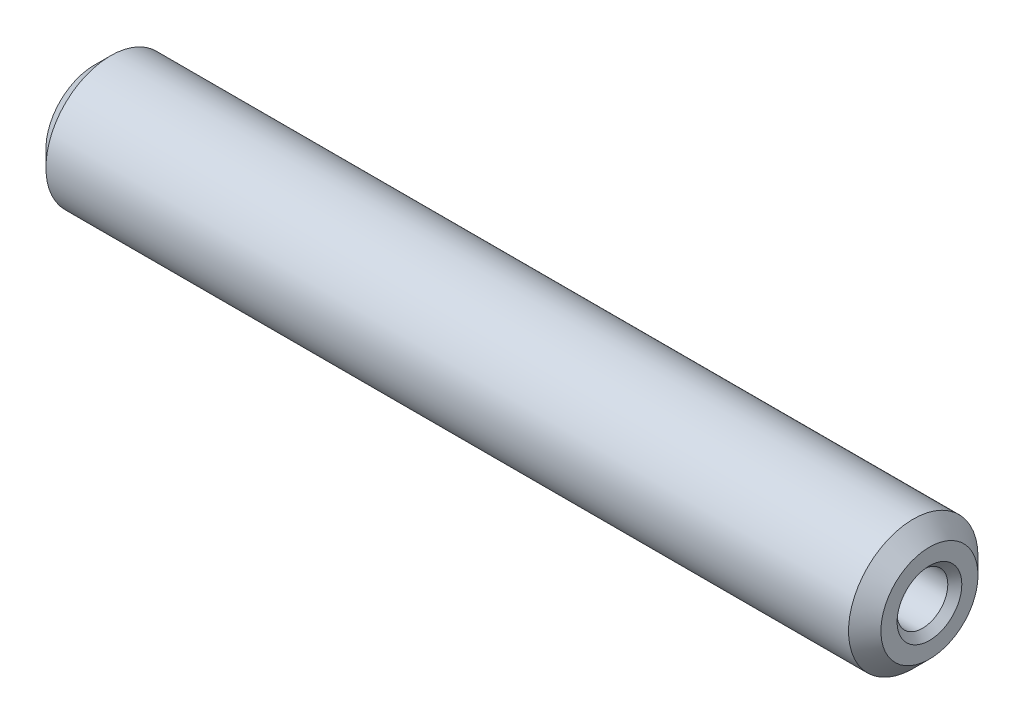
ISO-10303-21;
HEADER;
FILE_DESCRIPTION(('STEP AP214'),'2;1');
FILE_NAME('part.step','',(''),(''),'','','');
FILE_SCHEMA(('AUTOMOTIVE_DESIGN { 1 0 10303 214 1 1 1 1 }'));
ENDSEC;
DATA;
#1=APPLICATION_CONTEXT('core data for automotive mechanical design processes');
#2=APPLICATION_PROTOCOL_DEFINITION('international standard','automotive_design',2000,#1);
#3=PRODUCT_CONTEXT('',#1,'mechanical');
#4=PRODUCT('Part','Part','',(#3));
#5=PRODUCT_RELATED_PRODUCT_CATEGORY('part','',(#4));
#6=PRODUCT_DEFINITION_FORMATION('','',#4);
#7=PRODUCT_DEFINITION_CONTEXT('part definition',#1,'design');
#8=PRODUCT_DEFINITION('design','',#6,#7);
#9=PRODUCT_DEFINITION_SHAPE('','',#8);
#10=(LENGTH_UNIT() NAMED_UNIT(*) SI_UNIT(.MILLI.,.METRE.));
#11=(NAMED_UNIT(*) PLANE_ANGLE_UNIT() SI_UNIT($,.RADIAN.));
#12=(NAMED_UNIT(*) SI_UNIT($,.STERADIAN.) SOLID_ANGLE_UNIT());
#13=UNCERTAINTY_MEASURE_WITH_UNIT(LENGTH_MEASURE(1.E-05),#10,'distance_accuracy_value','');
#14=(GEOMETRIC_REPRESENTATION_CONTEXT(3) GLOBAL_UNCERTAINTY_ASSIGNED_CONTEXT((#13)) GLOBAL_UNIT_ASSIGNED_CONTEXT((#10,
#11,#12)) REPRESENTATION_CONTEXT('',''));
#15=CARTESIAN_POINT('',(0.,0.,0.));
#16=DIRECTION('',(0.,0.,1.));
#17=DIRECTION('',(1.,0.,0.));
#18=AXIS2_PLACEMENT_3D('',#15,#16,#17);
#19=CARTESIAN_POINT('',(0.,0.,0.));
#20=DIRECTION('',(1.,0.,0.));
#21=DIRECTION('',(0.,0.,-1.));
#22=AXIS2_PLACEMENT_3D('',#19,#20,#21);
#23=PLANE('',#22);
#24=CARTESIAN_POINT('',(0.,0.,0.));
#25=DIRECTION('',(1.,0.,0.));
#26=DIRECTION('',(0.,0.,-1.));
#27=AXIS2_PLACEMENT_3D('',#24,#25,#26);
#28=CIRCLE('',#27,1.5);
#29=CARTESIAN_POINT('',(0.,0.,-1.5));
#30=VERTEX_POINT('',#29);
#31=EDGE_CURVE('E107',#30,#30,#28,.T.);
#32=ORIENTED_EDGE('',*,*,#31,.F.);
#33=EDGE_LOOP('',(#32));
#34=FACE_BOUND('',#33,.T.);
#35=CARTESIAN_POINT('',(0.,0.,0.));
#36=DIRECTION('',(1.,0.,0.));
#37=DIRECTION('',(0.,0.,-1.));
#38=AXIS2_PLACEMENT_3D('',#35,#36,#37);
#39=CIRCLE('',#38,1.);
#40=CARTESIAN_POINT('',(0.,0.,-1.));
#41=VERTEX_POINT('',#40);
#42=EDGE_CURVE('E103',#41,#41,#39,.T.);
#43=ORIENTED_EDGE('',*,*,#42,.T.);
#44=EDGE_LOOP('',(#43));
#45=FACE_BOUND('',#44,.T.);
#46=ADVANCED_FACE('F16',(#34,#45),#23,.F.);
#47=CARTESIAN_POINT('',(0.,0.,0.));
#48=DIRECTION('',(1.,0.,0.));
#49=DIRECTION('',(0.,0.,-1.));
#50=AXIS2_PLACEMENT_3D('',#47,#48,#49);
#51=CONICAL_SURFACE('',#50,1.5,0.785398163397448);
#52=CARTESIAN_POINT('',(0.5,0.,0.));
#53=DIRECTION('',(1.,0.,0.));
#54=DIRECTION('',(0.,0.,-1.));
#55=AXIS2_PLACEMENT_3D('',#52,#53,#54);
#56=CIRCLE('',#55,2.);
#57=CARTESIAN_POINT('',(0.5,0.,-2.));
#58=VERTEX_POINT('',#57);
#59=EDGE_CURVE('E102',#58,#58,#56,.T.);
#60=ORIENTED_EDGE('',*,*,#59,.F.);
#61=EDGE_LOOP('',(#60));
#62=FACE_BOUND('',#61,.T.);
#63=ORIENTED_EDGE('',*,*,#31,.T.);
#64=EDGE_LOOP('',(#63));
#65=FACE_BOUND('',#64,.T.);
#66=ADVANCED_FACE('F70',(#62,#65),#51,.T.);
#67=CARTESIAN_POINT('',(0.,0.,0.));
#68=DIRECTION('',(-1.,0.,0.));
#69=DIRECTION('',(0.,0.,1.));
#70=AXIS2_PLACEMENT_3D('',#67,#68,#69);
#71=CONICAL_SURFACE('',#70,1.,0.785398163397449);
#72=CARTESIAN_POINT('',(0.2165,0.,0.));
#73=DIRECTION('',(1.,0.,0.));
#74=DIRECTION('',(0.,0.,-1.));
#75=AXIS2_PLACEMENT_3D('',#72,#73,#74);
#76=CIRCLE('',#75,0.7835);
#77=CARTESIAN_POINT('',(0.2165,0.,-0.7835));
#78=VERTEX_POINT('',#77);
#79=EDGE_CURVE('E47',#78,#78,#76,.T.);
#80=ORIENTED_EDGE('',*,*,#79,.T.);
#81=EDGE_LOOP('',(#80));
#82=FACE_BOUND('',#81,.T.);
#83=ORIENTED_EDGE('',*,*,#42,.F.);
#84=EDGE_LOOP('',(#83));
#85=FACE_BOUND('',#84,.T.);
#86=ADVANCED_FACE('F76',(#82,#85),#71,.F.);
#87=CARTESIAN_POINT('',(25.8,0.,0.));
#88=DIRECTION('',(1.,0.,0.));
#89=DIRECTION('',(0.,0.,-1.));
#90=AXIS2_PLACEMENT_3D('',#87,#88,#89);
#91=CYLINDRICAL_SURFACE('',#90,2.);
#92=CARTESIAN_POINT('',(25.3,0.,0.));
#93=DIRECTION('',(1.,0.,0.));
#94=DIRECTION('',(0.,0.,-1.));
#95=AXIS2_PLACEMENT_3D('',#92,#93,#94);
#96=CIRCLE('',#95,2.);
#97=CARTESIAN_POINT('',(25.3,0.,-2.));
#98=VERTEX_POINT('',#97);
#99=EDGE_CURVE('E41',#98,#98,#96,.T.);
#100=ORIENTED_EDGE('',*,*,#99,.F.);
#101=EDGE_LOOP('',(#100));
#102=FACE_BOUND('',#101,.T.);
#103=ORIENTED_EDGE('',*,*,#59,.T.);
#104=EDGE_LOOP('',(#103));
#105=FACE_BOUND('',#104,.T.);
#106=ADVANCED_FACE('F84',(#102,#105),#91,.T.);
#107=CARTESIAN_POINT('',(9.,0.,0.));
#108=DIRECTION('',(1.,0.,0.));
#109=DIRECTION('',(0.,0.,-1.));
#110=AXIS2_PLACEMENT_3D('',#107,#108,#109);
#111=CYLINDRICAL_SURFACE('',#110,0.7835);
#112=CARTESIAN_POINT('',(8.5476460640899,0.,0.));
#113=DIRECTION('',(1.,0.,0.));
#114=DIRECTION('',(0.,0.,-1.));
#115=AXIS2_PLACEMENT_3D('',#112,#113,#114);
#116=CIRCLE('',#115,0.7835);
#117=CARTESIAN_POINT('',(8.5476460640899,0.,-0.7835));
#118=VERTEX_POINT('',#117);
#119=EDGE_CURVE('E38',#118,#118,#116,.T.);
#120=ORIENTED_EDGE('',*,*,#119,.T.);
#121=EDGE_LOOP('',(#120));
#122=FACE_BOUND('',#121,.T.);
#123=ORIENTED_EDGE('',*,*,#79,.F.);
#124=EDGE_LOOP('',(#123));
#125=FACE_BOUND('',#124,.T.);
#126=ADVANCED_FACE('F88',(#122,#125),#111,.F.);
#127=CARTESIAN_POINT('',(25.3,0.,0.));
#128=DIRECTION('',(-1.,0.,0.));
#129=DIRECTION('',(0.,0.,1.));
#130=AXIS2_PLACEMENT_3D('',#127,#128,#129);
#131=CONICAL_SURFACE('',#130,2.,0.785398163397445);
#132=CARTESIAN_POINT('',(25.8,0.,0.));
#133=DIRECTION('',(1.,0.,0.));
#134=DIRECTION('',(0.,0.,-1.));
#135=AXIS2_PLACEMENT_3D('',#132,#133,#134);
#136=CIRCLE('',#135,1.5);
#137=CARTESIAN_POINT('',(25.8,0.,-1.5));
#138=VERTEX_POINT('',#137);
#139=EDGE_CURVE('E40',#138,#138,#136,.T.);
#140=ORIENTED_EDGE('',*,*,#139,.F.);
#141=EDGE_LOOP('',(#140));
#142=FACE_BOUND('',#141,.T.);
#143=ORIENTED_EDGE('',*,*,#99,.T.);
#144=EDGE_LOOP('',(#143));
#145=FACE_BOUND('',#144,.T.);
#146=ADVANCED_FACE('F34',(#142,#145),#131,.T.);
#147=CARTESIAN_POINT('',(8.5476460640899,0.,0.));
#148=DIRECTION('',(-1.,0.,0.));
#149=DIRECTION('',(0.,0.,1.));
#150=AXIS2_PLACEMENT_3D('',#147,#148,#149);
#151=CONICAL_SURFACE('',#150,0.7835,1.04719755119657);
#152=CARTESIAN_POINT('',(9.,0.,0.));
#153=VERTEX_POINT('',#152);
#154=VERTEX_LOOP('',#153);
#155=FACE_BOUND('',#154,.T.);
#156=ORIENTED_EDGE('',*,*,#119,.F.);
#157=EDGE_LOOP('',(#156));
#158=FACE_BOUND('',#157,.T.);
#159=ADVANCED_FACE('F30',(#155,#158),#151,.F.);
#160=CARTESIAN_POINT('',(25.8,1.5,0.));
#161=DIRECTION('',(-1.,0.,0.));
#162=DIRECTION('',(0.,0.,1.));
#163=AXIS2_PLACEMENT_3D('',#160,#161,#162);
#164=PLANE('',#163);
#165=CARTESIAN_POINT('',(25.8,0.,0.));
#166=DIRECTION('',(1.,0.,0.));
#167=DIRECTION('',(0.,0.,-1.));
#168=AXIS2_PLACEMENT_3D('',#165,#166,#167);
#169=CIRCLE('',#168,1.00000000000001);
#170=CARTESIAN_POINT('',(25.8,0.,-1.00000000000001));
#171=VERTEX_POINT('',#170);
#172=EDGE_CURVE('E44',#171,#171,#169,.T.);
#173=ORIENTED_EDGE('',*,*,#172,.F.);
#174=EDGE_LOOP('',(#173));
#175=FACE_BOUND('',#174,.T.);
#176=ORIENTED_EDGE('',*,*,#139,.T.);
#177=EDGE_LOOP('',(#176));
#178=FACE_BOUND('',#177,.T.);
#179=ADVANCED_FACE('F33',(#175,#178),#164,.F.);
#180=CARTESIAN_POINT('',(25.5835,0.,0.));
#181=DIRECTION('',(1.,0.,0.));
#182=DIRECTION('',(0.,0.,-1.));
#183=AXIS2_PLACEMENT_3D('',#180,#181,#182);
#184=CONICAL_SURFACE('',#183,0.7835,0.785398163397453);
#185=ORIENTED_EDGE('',*,*,#172,.T.);
#186=EDGE_LOOP('',(#185));
#187=FACE_BOUND('',#186,.T.);
#188=CARTESIAN_POINT('',(25.5835,0.,0.));
#189=DIRECTION('',(1.,0.,0.));
#190=DIRECTION('',(0.,0.,-1.));
#191=AXIS2_PLACEMENT_3D('',#188,#189,#190);
#192=CIRCLE('',#191,0.7835);
#193=CARTESIAN_POINT('',(25.5835,0.,-0.7835));
#194=VERTEX_POINT('',#193);
#195=EDGE_CURVE('E24',#194,#194,#192,.T.);
#196=ORIENTED_EDGE('',*,*,#195,.F.);
#197=EDGE_LOOP('',(#196));
#198=FACE_BOUND('',#197,.T.);
#199=ADVANCED_FACE('F58',(#187,#198),#184,.F.);
#200=CARTESIAN_POINT('',(25.8,0.,0.));
#201=DIRECTION('',(1.,0.,0.));
#202=DIRECTION('',(0.,0.,-1.));
#203=AXIS2_PLACEMENT_3D('',#200,#201,#202);
#204=CYLINDRICAL_SURFACE('',#203,0.7835);
#205=ORIENTED_EDGE('',*,*,#195,.T.);
#206=EDGE_LOOP('',(#205));
#207=FACE_BOUND('',#206,.T.);
#208=CARTESIAN_POINT('',(17.25235393591,0.,0.));
#209=DIRECTION('',(1.,0.,0.));
#210=DIRECTION('',(0.,0.,-1.));
#211=AXIS2_PLACEMENT_3D('',#208,#209,#210);
#212=CIRCLE('',#211,0.7835);
#213=CARTESIAN_POINT('',(17.25235393591,0.,-0.7835));
#214=VERTEX_POINT('',#213);
#215=EDGE_CURVE('E11',#214,#214,#212,.T.);
#216=ORIENTED_EDGE('',*,*,#215,.F.);
#217=EDGE_LOOP('',(#216));
#218=FACE_BOUND('',#217,.T.);
#219=ADVANCED_FACE('F55',(#207,#218),#204,.F.);
#220=CARTESIAN_POINT('',(16.8,0.,0.));
#221=DIRECTION('',(1.,0.,0.));
#222=DIRECTION('',(0.,0.,-1.));
#223=AXIS2_PLACEMENT_3D('',#220,#221,#222);
#224=CONICAL_SURFACE('',#223,0.,1.04719755119667);
#225=ORIENTED_EDGE('',*,*,#215,.T.);
#226=EDGE_LOOP('',(#225));
#227=FACE_BOUND('',#226,.T.);
#228=CARTESIAN_POINT('',(16.8,0.,0.));
#229=VERTEX_POINT('',#228);
#230=VERTEX_LOOP('',#229);
#231=FACE_BOUND('',#230,.T.);
#232=ADVANCED_FACE('F18',(#227,#231),#224,.F.);
#233=CLOSED_SHELL('',(#46,#66,#86,#106,#126,#146,#159,#179,#199,#219,#232));
#234=MANIFOLD_SOLID_BREP('B1',#233);
#235=ADVANCED_BREP_SHAPE_REPRESENTATION('',(#18,#234),#14);
#236=SHAPE_DEFINITION_REPRESENTATION(#9,#235);
ENDSEC;
END-ISO-10303-21;
